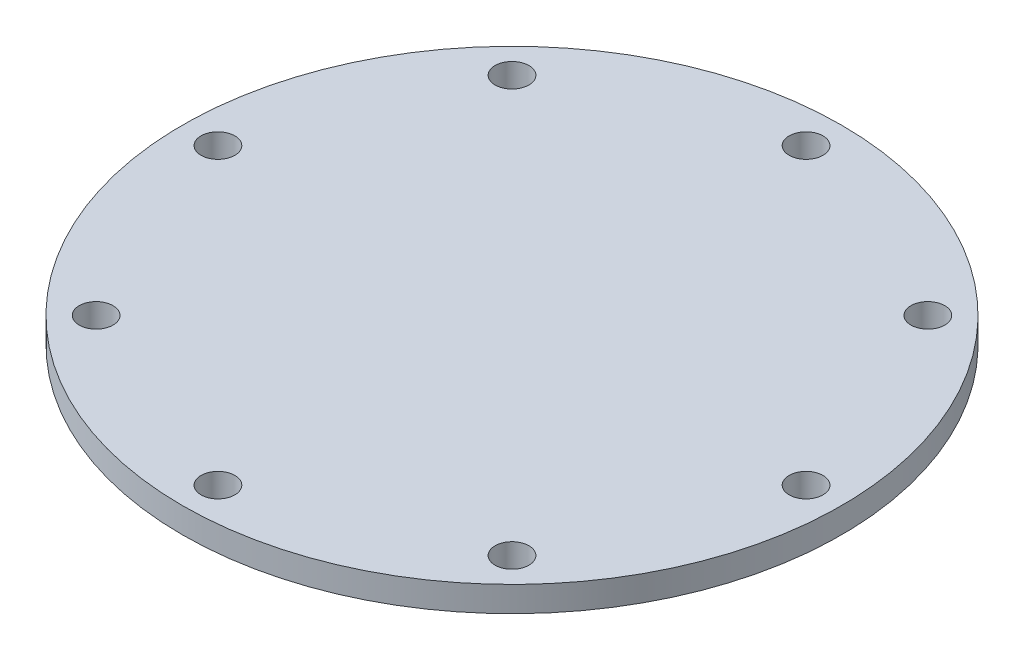
ISO-10303-21;
HEADER;
FILE_DESCRIPTION(('STEP AP214'),'2;1');
FILE_NAME('part.step','',(''),(''),'','','');
FILE_SCHEMA(('AUTOMOTIVE_DESIGN { 1 0 10303 214 1 1 1 1 }'));
ENDSEC;
DATA;
#1=APPLICATION_CONTEXT('core data for automotive mechanical design processes');
#2=APPLICATION_PROTOCOL_DEFINITION('international standard','automotive_design',2000,#1);
#3=PRODUCT_CONTEXT('',#1,'mechanical');
#4=PRODUCT('Part','Part','',(#3));
#5=PRODUCT_RELATED_PRODUCT_CATEGORY('part','',(#4));
#6=PRODUCT_DEFINITION_FORMATION('','',#4);
#7=PRODUCT_DEFINITION_CONTEXT('part definition',#1,'design');
#8=PRODUCT_DEFINITION('design','',#6,#7);
#9=PRODUCT_DEFINITION_SHAPE('','',#8);
#10=(LENGTH_UNIT() NAMED_UNIT(*) SI_UNIT(.MILLI.,.METRE.));
#11=(NAMED_UNIT(*) PLANE_ANGLE_UNIT() SI_UNIT($,.RADIAN.));
#12=(NAMED_UNIT(*) SI_UNIT($,.STERADIAN.) SOLID_ANGLE_UNIT());
#13=UNCERTAINTY_MEASURE_WITH_UNIT(LENGTH_MEASURE(1.E-05),#10,'distance_accuracy_value','');
#14=(GEOMETRIC_REPRESENTATION_CONTEXT(3) GLOBAL_UNCERTAINTY_ASSIGNED_CONTEXT((#13)) GLOBAL_UNIT_ASSIGNED_CONTEXT((#10,
#11,#12)) REPRESENTATION_CONTEXT('',''));
#15=CARTESIAN_POINT('',(0.,0.,0.));
#16=DIRECTION('',(0.,0.,1.));
#17=DIRECTION('',(1.,0.,0.));
#18=AXIS2_PLACEMENT_3D('',#15,#16,#17);
#19=CARTESIAN_POINT('',(0.,15.,0.));
#20=DIRECTION('',(0.,-1.,0.));
#21=DIRECTION('',(0.,0.,-1.));
#22=AXIS2_PLACEMENT_3D('',#19,#20,#21);
#23=CYLINDRICAL_SURFACE('',#22,195.);
#24=CARTESIAN_POINT('',(0.,15.,0.));
#25=DIRECTION('',(0.,1.,0.));
#26=DIRECTION('',(0.,0.,1.));
#27=AXIS2_PLACEMENT_3D('',#24,#25,#26);
#28=CIRCLE('',#27,195.);
#29=CARTESIAN_POINT('',(0.,15.,195.));
#30=VERTEX_POINT('',#29);
#31=EDGE_CURVE('E10',#30,#30,#28,.T.);
#32=ORIENTED_EDGE('',*,*,#31,.F.);
#33=EDGE_LOOP('',(#32));
#34=FACE_BOUND('',#33,.T.);
#35=CARTESIAN_POINT('',(0.,0.,0.));
#36=DIRECTION('',(0.,1.,0.));
#37=DIRECTION('',(0.,0.,1.));
#38=AXIS2_PLACEMENT_3D('',#35,#36,#37);
#39=CIRCLE('',#38,195.);
#40=CARTESIAN_POINT('',(0.,0.,195.));
#41=VERTEX_POINT('',#40);
#42=EDGE_CURVE('E39',#41,#41,#39,.T.);
#43=ORIENTED_EDGE('',*,*,#42,.T.);
#44=EDGE_LOOP('',(#43));
#45=FACE_BOUND('',#44,.T.);
#46=ADVANCED_FACE('F36',(#34,#45),#23,.T.);
#47=CARTESIAN_POINT('',(0.,15.,0.));
#48=DIRECTION('',(0.,1.,0.));
#49=DIRECTION('',(0.,0.,1.));
#50=AXIS2_PLACEMENT_3D('',#47,#48,#49);
#51=PLANE('',#50);
#52=CARTESIAN_POINT('',(-174.,15.,0.));
#53=DIRECTION('',(0.,1.,0.));
#54=DIRECTION('',(0.,0.,1.));
#55=AXIS2_PLACEMENT_3D('',#52,#53,#54);
#56=CIRCLE('',#55,10.);
#57=CARTESIAN_POINT('',(-174.,15.,10.));
#58=VERTEX_POINT('',#57);
#59=EDGE_CURVE('E88',#58,#58,#56,.T.);
#60=ORIENTED_EDGE('',*,*,#59,.F.);
#61=EDGE_LOOP('',(#60));
#62=FACE_BOUND('',#61,.T.);
#63=CARTESIAN_POINT('',(-123.036579926459,15.,-123.036579926459));
#64=DIRECTION('',(0.,1.,0.));
#65=DIRECTION('',(0.,0.,1.));
#66=AXIS2_PLACEMENT_3D('',#63,#64,#65);
#67=CIRCLE('',#66,10.);
#68=CARTESIAN_POINT('',(-123.036579926459,15.,-113.036579926459));
#69=VERTEX_POINT('',#68);
#70=EDGE_CURVE('E82',#69,#69,#67,.T.);
#71=ORIENTED_EDGE('',*,*,#70,.F.);
#72=EDGE_LOOP('',(#71));
#73=FACE_BOUND('',#72,.T.);
#74=CARTESIAN_POINT('',(0.,15.,-174.));
#75=DIRECTION('',(0.,1.,0.));
#76=DIRECTION('',(0.,0.,1.));
#77=AXIS2_PLACEMENT_3D('',#74,#75,#76);
#78=CIRCLE('',#77,10.);
#79=CARTESIAN_POINT('',(0.,15.,-164.));
#80=VERTEX_POINT('',#79);
#81=EDGE_CURVE('E76',#80,#80,#78,.T.);
#82=ORIENTED_EDGE('',*,*,#81,.F.);
#83=EDGE_LOOP('',(#82));
#84=FACE_BOUND('',#83,.T.);
#85=CARTESIAN_POINT('',(123.036579926459,15.,-123.036579926459));
#86=DIRECTION('',(0.,1.,0.));
#87=DIRECTION('',(0.,0.,1.));
#88=AXIS2_PLACEMENT_3D('',#85,#86,#87);
#89=CIRCLE('',#88,10.);
#90=CARTESIAN_POINT('',(123.036579926459,15.,-113.036579926459));
#91=VERTEX_POINT('',#90);
#92=EDGE_CURVE('E70',#91,#91,#89,.T.);
#93=ORIENTED_EDGE('',*,*,#92,.F.);
#94=EDGE_LOOP('',(#93));
#95=FACE_BOUND('',#94,.T.);
#96=CARTESIAN_POINT('',(174.,15.,0.));
#97=DIRECTION('',(0.,1.,0.));
#98=DIRECTION('',(0.,0.,1.));
#99=AXIS2_PLACEMENT_3D('',#96,#97,#98);
#100=CIRCLE('',#99,10.);
#101=CARTESIAN_POINT('',(174.,15.,10.));
#102=VERTEX_POINT('',#101);
#103=EDGE_CURVE('E64',#102,#102,#100,.T.);
#104=ORIENTED_EDGE('',*,*,#103,.F.);
#105=EDGE_LOOP('',(#104));
#106=FACE_BOUND('',#105,.T.);
#107=CARTESIAN_POINT('',(123.036579926459,15.,123.036579926459));
#108=DIRECTION('',(0.,1.,0.));
#109=DIRECTION('',(0.,0.,1.));
#110=AXIS2_PLACEMENT_3D('',#107,#108,#109);
#111=CIRCLE('',#110,10.);
#112=CARTESIAN_POINT('',(123.036579926459,15.,133.036579926459));
#113=VERTEX_POINT('',#112);
#114=EDGE_CURVE('E58',#113,#113,#111,.T.);
#115=ORIENTED_EDGE('',*,*,#114,.F.);
#116=EDGE_LOOP('',(#115));
#117=FACE_BOUND('',#116,.T.);
#118=CARTESIAN_POINT('',(0.,15.,174.));
#119=DIRECTION('',(0.,1.,0.));
#120=DIRECTION('',(0.,0.,1.));
#121=AXIS2_PLACEMENT_3D('',#118,#119,#120);
#122=CIRCLE('',#121,10.);
#123=CARTESIAN_POINT('',(0.,15.,184.));
#124=VERTEX_POINT('',#123);
#125=EDGE_CURVE('E51',#124,#124,#122,.T.);
#126=ORIENTED_EDGE('',*,*,#125,.F.);
#127=EDGE_LOOP('',(#126));
#128=FACE_BOUND('',#127,.T.);
#129=CARTESIAN_POINT('',(-123.036579926459,15.,123.036579926459));
#130=DIRECTION('',(0.,1.,0.));
#131=DIRECTION('',(0.,0.,1.));
#132=AXIS2_PLACEMENT_3D('',#129,#130,#131);
#133=CIRCLE('',#132,10.);
#134=CARTESIAN_POINT('',(-123.036579926459,15.,133.036579926459));
#135=VERTEX_POINT('',#134);
#136=EDGE_CURVE('E52',#135,#135,#133,.T.);
#137=ORIENTED_EDGE('',*,*,#136,.F.);
#138=EDGE_LOOP('',(#137));
#139=FACE_BOUND('',#138,.T.);
#140=ORIENTED_EDGE('',*,*,#31,.T.);
#141=EDGE_LOOP('',(#140));
#142=FACE_BOUND('',#141,.T.);
#143=ADVANCED_FACE('F99',(#62,#73,#84,#95,#106,#117,#128,#139,#142),#51,.T.);
#144=CARTESIAN_POINT('',(0.,0.,0.));
#145=DIRECTION('',(0.,1.,0.));
#146=DIRECTION('',(0.,0.,1.));
#147=AXIS2_PLACEMENT_3D('',#144,#145,#146);
#148=PLANE('',#147);
#149=CARTESIAN_POINT('',(-174.,0.,0.));
#150=DIRECTION('',(0.,1.,0.));
#151=DIRECTION('',(0.,0.,1.));
#152=AXIS2_PLACEMENT_3D('',#149,#150,#151);
#153=CIRCLE('',#152,10.);
#154=CARTESIAN_POINT('',(-174.,0.,10.));
#155=VERTEX_POINT('',#154);
#156=EDGE_CURVE('E46',#155,#155,#153,.F.);
#157=ORIENTED_EDGE('',*,*,#156,.F.);
#158=EDGE_LOOP('',(#157));
#159=FACE_BOUND('',#158,.T.);
#160=CARTESIAN_POINT('',(-123.036579926459,0.,-123.036579926459));
#161=DIRECTION('',(0.,1.,0.));
#162=DIRECTION('',(0.,0.,1.));
#163=AXIS2_PLACEMENT_3D('',#160,#161,#162);
#164=CIRCLE('',#163,10.);
#165=CARTESIAN_POINT('',(-123.036579926459,0.,-113.036579926459));
#166=VERTEX_POINT('',#165);
#167=EDGE_CURVE('E85',#166,#166,#164,.F.);
#168=ORIENTED_EDGE('',*,*,#167,.F.);
#169=EDGE_LOOP('',(#168));
#170=FACE_BOUND('',#169,.T.);
#171=CARTESIAN_POINT('',(0.,0.,-174.));
#172=DIRECTION('',(0.,1.,0.));
#173=DIRECTION('',(0.,0.,1.));
#174=AXIS2_PLACEMENT_3D('',#171,#172,#173);
#175=CIRCLE('',#174,10.);
#176=CARTESIAN_POINT('',(0.,0.,-164.));
#177=VERTEX_POINT('',#176);
#178=EDGE_CURVE('E79',#177,#177,#175,.F.);
#179=ORIENTED_EDGE('',*,*,#178,.F.);
#180=EDGE_LOOP('',(#179));
#181=FACE_BOUND('',#180,.T.);
#182=CARTESIAN_POINT('',(123.036579926459,0.,-123.036579926459));
#183=DIRECTION('',(0.,1.,0.));
#184=DIRECTION('',(0.,0.,1.));
#185=AXIS2_PLACEMENT_3D('',#182,#183,#184);
#186=CIRCLE('',#185,10.);
#187=CARTESIAN_POINT('',(123.036579926459,0.,-113.036579926459));
#188=VERTEX_POINT('',#187);
#189=EDGE_CURVE('E73',#188,#188,#186,.F.);
#190=ORIENTED_EDGE('',*,*,#189,.F.);
#191=EDGE_LOOP('',(#190));
#192=FACE_BOUND('',#191,.T.);
#193=CARTESIAN_POINT('',(174.,0.,0.));
#194=DIRECTION('',(0.,1.,0.));
#195=DIRECTION('',(0.,0.,1.));
#196=AXIS2_PLACEMENT_3D('',#193,#194,#195);
#197=CIRCLE('',#196,10.);
#198=CARTESIAN_POINT('',(174.,0.,10.));
#199=VERTEX_POINT('',#198);
#200=EDGE_CURVE('E67',#199,#199,#197,.F.);
#201=ORIENTED_EDGE('',*,*,#200,.F.);
#202=EDGE_LOOP('',(#201));
#203=FACE_BOUND('',#202,.T.);
#204=CARTESIAN_POINT('',(123.036579926459,0.,123.036579926459));
#205=DIRECTION('',(0.,1.,0.));
#206=DIRECTION('',(0.,0.,1.));
#207=AXIS2_PLACEMENT_3D('',#204,#205,#206);
#208=CIRCLE('',#207,10.);
#209=CARTESIAN_POINT('',(123.036579926459,0.,133.036579926459));
#210=VERTEX_POINT('',#209);
#211=EDGE_CURVE('E61',#210,#210,#208,.F.);
#212=ORIENTED_EDGE('',*,*,#211,.F.);
#213=EDGE_LOOP('',(#212));
#214=FACE_BOUND('',#213,.T.);
#215=CARTESIAN_POINT('',(0.,0.,174.));
#216=DIRECTION('',(0.,1.,0.));
#217=DIRECTION('',(0.,0.,1.));
#218=AXIS2_PLACEMENT_3D('',#215,#216,#217);
#219=CIRCLE('',#218,10.);
#220=CARTESIAN_POINT('',(0.,0.,184.));
#221=VERTEX_POINT('',#220);
#222=EDGE_CURVE('E55',#221,#221,#219,.F.);
#223=ORIENTED_EDGE('',*,*,#222,.F.);
#224=EDGE_LOOP('',(#223));
#225=FACE_BOUND('',#224,.T.);
#226=CARTESIAN_POINT('',(-123.036579926459,0.,123.036579926459));
#227=DIRECTION('',(0.,1.,0.));
#228=DIRECTION('',(0.,0.,1.));
#229=AXIS2_PLACEMENT_3D('',#226,#227,#228);
#230=CIRCLE('',#229,10.);
#231=CARTESIAN_POINT('',(-123.036579926459,0.,133.036579926459));
#232=VERTEX_POINT('',#231);
#233=EDGE_CURVE('E48',#232,#232,#230,.F.);
#234=ORIENTED_EDGE('',*,*,#233,.F.);
#235=EDGE_LOOP('',(#234));
#236=FACE_BOUND('',#235,.T.);
#237=ORIENTED_EDGE('',*,*,#42,.F.);
#238=EDGE_LOOP('',(#237));
#239=FACE_BOUND('',#238,.T.);
#240=ADVANCED_FACE('F102',(#159,#170,#181,#192,#203,#214,#225,#236,#239),#148,.F.);
#241=CARTESIAN_POINT('',(-123.036579926459,-0.000999999999999265,123.036579926459));
#242=DIRECTION('',(0.,1.,0.));
#243=DIRECTION('',(0.,0.,1.));
#244=AXIS2_PLACEMENT_3D('',#241,#242,#243);
#245=CYLINDRICAL_SURFACE('',#244,10.);
#246=CARTESIAN_POINT('',(-123.036579926459,15.,133.036579926459));
#247=CARTESIAN_POINT('',(-123.036579926459,14.84375,133.036579926459));
#248=CARTESIAN_POINT('',(-123.036579926459,14.6875,133.036579926459));
#249=CARTESIAN_POINT('',(-123.036579926459,14.375,133.036579926459));
#250=CARTESIAN_POINT('',(-123.036579926459,14.21875,133.036579926459));
#251=CARTESIAN_POINT('',(-123.036579926459,13.90625,133.036579926459));
#252=CARTESIAN_POINT('',(-123.036579926459,13.75,133.036579926459));
#253=CARTESIAN_POINT('',(-123.036579926459,13.4375,133.036579926459));
#254=CARTESIAN_POINT('',(-123.036579926459,13.28125,133.036579926459));
#255=CARTESIAN_POINT('',(-123.036579926459,12.96875,133.036579926459));
#256=CARTESIAN_POINT('',(-123.036579926459,12.8125,133.036579926459));
#257=CARTESIAN_POINT('',(-123.036579926459,12.5,133.036579926459));
#258=CARTESIAN_POINT('',(-123.036579926459,12.34375,133.036579926459));
#259=CARTESIAN_POINT('',(-123.036579926459,12.03125,133.036579926459));
#260=CARTESIAN_POINT('',(-123.036579926459,11.875,133.036579926459));
#261=CARTESIAN_POINT('',(-123.036579926459,11.5625,133.036579926459));
#262=CARTESIAN_POINT('',(-123.036579926459,11.40625,133.036579926459));
#263=CARTESIAN_POINT('',(-123.036579926459,11.09375,133.036579926459));
#264=CARTESIAN_POINT('',(-123.036579926459,10.9375,133.036579926459));
#265=CARTESIAN_POINT('',(-123.036579926459,10.625,133.036579926459));
#266=CARTESIAN_POINT('',(-123.036579926459,10.46875,133.036579926459));
#267=CARTESIAN_POINT('',(-123.036579926459,10.15625,133.036579926459));
#268=CARTESIAN_POINT('',(-123.036579926459,10.,133.036579926459));
#269=CARTESIAN_POINT('',(-123.036579926459,9.6875,133.036579926459));
#270=CARTESIAN_POINT('',(-123.036579926459,9.53125,133.036579926459));
#271=CARTESIAN_POINT('',(-123.036579926459,9.21875,133.036579926459));
#272=CARTESIAN_POINT('',(-123.036579926459,9.0625,133.036579926459));
#273=CARTESIAN_POINT('',(-123.036579926459,8.75,133.036579926459));
#274=CARTESIAN_POINT('',(-123.036579926459,8.59375,133.036579926459));
#275=CARTESIAN_POINT('',(-123.036579926459,8.28125,133.036579926459));
#276=CARTESIAN_POINT('',(-123.036579926459,8.125,133.036579926459));
#277=CARTESIAN_POINT('',(-123.036579926459,7.8125,133.036579926459));
#278=CARTESIAN_POINT('',(-123.036579926459,7.65625,133.036579926459));
#279=CARTESIAN_POINT('',(-123.036579926459,7.34375,133.036579926459));
#280=CARTESIAN_POINT('',(-123.036579926459,7.1875,133.036579926459));
#281=CARTESIAN_POINT('',(-123.036579926459,6.875,133.036579926459));
#282=CARTESIAN_POINT('',(-123.036579926459,6.71875,133.036579926459));
#283=CARTESIAN_POINT('',(-123.036579926459,6.40625,133.036579926459));
#284=CARTESIAN_POINT('',(-123.036579926459,6.25,133.036579926459));
#285=CARTESIAN_POINT('',(-123.036579926459,5.9375,133.036579926459));
#286=CARTESIAN_POINT('',(-123.036579926459,5.78125,133.036579926459));
#287=CARTESIAN_POINT('',(-123.036579926459,5.46875,133.036579926459));
#288=CARTESIAN_POINT('',(-123.036579926459,5.3125,133.036579926459));
#289=CARTESIAN_POINT('',(-123.036579926459,5.,133.036579926459));
#290=CARTESIAN_POINT('',(-123.036579926459,4.84375,133.036579926459));
#291=CARTESIAN_POINT('',(-123.036579926459,4.53125,133.036579926459));
#292=CARTESIAN_POINT('',(-123.036579926459,4.375,133.036579926459));
#293=CARTESIAN_POINT('',(-123.036579926459,4.0625,133.036579926459));
#294=CARTESIAN_POINT('',(-123.036579926459,3.90625,133.036579926459));
#295=CARTESIAN_POINT('',(-123.036579926459,3.59375,133.036579926459));
#296=CARTESIAN_POINT('',(-123.036579926459,3.4375,133.036579926459));
#297=CARTESIAN_POINT('',(-123.036579926459,3.125,133.036579926459));
#298=CARTESIAN_POINT('',(-123.036579926459,2.96875,133.036579926459));
#299=CARTESIAN_POINT('',(-123.036579926459,2.65625,133.036579926459));
#300=CARTESIAN_POINT('',(-123.036579926459,2.5,133.036579926459));
#301=CARTESIAN_POINT('',(-123.036579926459,2.1875,133.036579926459));
#302=CARTESIAN_POINT('',(-123.036579926459,2.03125,133.036579926459));
#303=CARTESIAN_POINT('',(-123.036579926459,1.71875,133.036579926459));
#304=CARTESIAN_POINT('',(-123.036579926459,1.5625,133.036579926459));
#305=CARTESIAN_POINT('',(-123.036579926459,1.25,133.036579926459));
#306=CARTESIAN_POINT('',(-123.036579926459,1.09375,133.036579926459));
#307=CARTESIAN_POINT('',(-123.036579926459,0.781250000000001,133.036579926459));
#308=CARTESIAN_POINT('',(-123.036579926459,0.625,133.036579926459));
#309=CARTESIAN_POINT('',(-123.036579926459,0.3125,133.036579926459));
#310=CARTESIAN_POINT('',(-123.036579926459,0.15625,133.036579926459));
#311=CARTESIAN_POINT('',(-123.036579926459,0.,133.036579926459));
#312=B_SPLINE_CURVE_WITH_KNOTS('',3,(#246,#247,#248,#249,#250,#251,#252,#253,#254,#255,#256,
#257,#258,#259,#260,#261,#262,#263,#264,#265,#266,#267,#268,#269,#270,#271,#272,#273,#274,#275,
#276,#277,#278,#279,#280,#281,#282,#283,#284,#285,#286,#287,#288,#289,#290,#291,#292,#293,#294,
#295,#296,#297,#298,#299,#300,#301,#302,#303,#304,#305,#306,#307,#308,#309,#310,#311),
.UNSPECIFIED.,.F.,.F.,(4,2,2,2,2,2,2,2,2,2,2,2,2,2,2,2,2,2,2,2,2,2,2,2,2,2,2,2,2,2,2,2,4),(0.,
0.46875,0.937500000000001,1.40625,1.875,2.34375,2.8125,3.28125,3.75,4.21875,4.6875,5.15625,
5.625,6.09375,6.5625,7.03125,7.5,7.96875,8.4375,8.90625,9.375,9.84375,10.3125,10.78125,11.25,
11.71875,12.1875,12.65625,13.125,13.59375,14.0625,14.53125,15.),.UNSPECIFIED.);
#313=EDGE_CURVE('BSEAM118',#135,#232,#312,.T.);
#314=ORIENTED_EDGE('',*,*,#136,.T.);
#315=ORIENTED_EDGE('',*,*,#233,.T.);
#316=ORIENTED_EDGE('',*,*,#313,.T.);
#317=ORIENTED_EDGE('',*,*,#313,.F.);
#318=EDGE_LOOP('',(#314,#316,#315,#317));
#319=FACE_BOUND('',#318,.T.);
#320=ADVANCED_FACE('F118',(#319),#245,.F.);
#321=CARTESIAN_POINT('',(0.,-0.000999999999999265,174.));
#322=DIRECTION('',(0.,1.,0.));
#323=DIRECTION('',(0.,0.,1.));
#324=AXIS2_PLACEMENT_3D('',#321,#322,#323);
#325=CYLINDRICAL_SURFACE('',#324,10.);
#326=CARTESIAN_POINT('',(0.,15.,184.));
#327=CARTESIAN_POINT('',(0.,14.84375,184.));
#328=CARTESIAN_POINT('',(0.,14.6875,184.));
#329=CARTESIAN_POINT('',(0.,14.375,184.));
#330=CARTESIAN_POINT('',(0.,14.21875,184.));
#331=CARTESIAN_POINT('',(0.,13.90625,184.));
#332=CARTESIAN_POINT('',(0.,13.75,184.));
#333=CARTESIAN_POINT('',(0.,13.4375,184.));
#334=CARTESIAN_POINT('',(0.,13.28125,184.));
#335=CARTESIAN_POINT('',(0.,12.96875,184.));
#336=CARTESIAN_POINT('',(0.,12.8125,184.));
#337=CARTESIAN_POINT('',(0.,12.5,184.));
#338=CARTESIAN_POINT('',(0.,12.34375,184.));
#339=CARTESIAN_POINT('',(0.,12.03125,184.));
#340=CARTESIAN_POINT('',(0.,11.875,184.));
#341=CARTESIAN_POINT('',(0.,11.5625,184.));
#342=CARTESIAN_POINT('',(0.,11.40625,184.));
#343=CARTESIAN_POINT('',(0.,11.09375,184.));
#344=CARTESIAN_POINT('',(0.,10.9375,184.));
#345=CARTESIAN_POINT('',(0.,10.625,184.));
#346=CARTESIAN_POINT('',(0.,10.46875,184.));
#347=CARTESIAN_POINT('',(0.,10.15625,184.));
#348=CARTESIAN_POINT('',(0.,10.,184.));
#349=CARTESIAN_POINT('',(0.,9.6875,184.));
#350=CARTESIAN_POINT('',(0.,9.53125,184.));
#351=CARTESIAN_POINT('',(0.,9.21875,184.));
#352=CARTESIAN_POINT('',(0.,9.0625,184.));
#353=CARTESIAN_POINT('',(0.,8.75,184.));
#354=CARTESIAN_POINT('',(0.,8.59375,184.));
#355=CARTESIAN_POINT('',(0.,8.28125,184.));
#356=CARTESIAN_POINT('',(0.,8.125,184.));
#357=CARTESIAN_POINT('',(0.,7.8125,184.));
#358=CARTESIAN_POINT('',(0.,7.65625,184.));
#359=CARTESIAN_POINT('',(0.,7.34375,184.));
#360=CARTESIAN_POINT('',(0.,7.1875,184.));
#361=CARTESIAN_POINT('',(0.,6.875,184.));
#362=CARTESIAN_POINT('',(0.,6.71875,184.));
#363=CARTESIAN_POINT('',(0.,6.40625,184.));
#364=CARTESIAN_POINT('',(0.,6.25,184.));
#365=CARTESIAN_POINT('',(0.,5.9375,184.));
#366=CARTESIAN_POINT('',(0.,5.78125,184.));
#367=CARTESIAN_POINT('',(0.,5.46875,184.));
#368=CARTESIAN_POINT('',(0.,5.3125,184.));
#369=CARTESIAN_POINT('',(0.,5.,184.));
#370=CARTESIAN_POINT('',(0.,4.84375,184.));
#371=CARTESIAN_POINT('',(0.,4.53125,184.));
#372=CARTESIAN_POINT('',(0.,4.375,184.));
#373=CARTESIAN_POINT('',(0.,4.0625,184.));
#374=CARTESIAN_POINT('',(0.,3.90625,184.));
#375=CARTESIAN_POINT('',(0.,3.59375,184.));
#376=CARTESIAN_POINT('',(0.,3.4375,184.));
#377=CARTESIAN_POINT('',(0.,3.125,184.));
#378=CARTESIAN_POINT('',(0.,2.96875,184.));
#379=CARTESIAN_POINT('',(0.,2.65625,184.));
#380=CARTESIAN_POINT('',(0.,2.5,184.));
#381=CARTESIAN_POINT('',(0.,2.1875,184.));
#382=CARTESIAN_POINT('',(0.,2.03125,184.));
#383=CARTESIAN_POINT('',(0.,1.71875,184.));
#384=CARTESIAN_POINT('',(0.,1.5625,184.));
#385=CARTESIAN_POINT('',(0.,1.25,184.));
#386=CARTESIAN_POINT('',(0.,1.09375,184.));
#387=CARTESIAN_POINT('',(0.,0.781250000000001,184.));
#388=CARTESIAN_POINT('',(0.,0.625,184.));
#389=CARTESIAN_POINT('',(0.,0.3125,184.));
#390=CARTESIAN_POINT('',(0.,0.15625,184.));
#391=CARTESIAN_POINT('',(0.,0.,184.));
#392=B_SPLINE_CURVE_WITH_KNOTS('',3,(#326,#327,#328,#329,#330,#331,#332,#333,#334,#335,#336,
#337,#338,#339,#340,#341,#342,#343,#344,#345,#346,#347,#348,#349,#350,#351,#352,#353,#354,#355,
#356,#357,#358,#359,#360,#361,#362,#363,#364,#365,#366,#367,#368,#369,#370,#371,#372,#373,#374,
#375,#376,#377,#378,#379,#380,#381,#382,#383,#384,#385,#386,#387,#388,#389,#390,#391),
.UNSPECIFIED.,.F.,.F.,(4,2,2,2,2,2,2,2,2,2,2,2,2,2,2,2,2,2,2,2,2,2,2,2,2,2,2,2,2,2,2,2,4),(0.,
0.46875,0.937500000000001,1.40625,1.875,2.34375,2.8125,3.28125,3.75,4.21875,4.6875,5.15625,
5.625,6.09375,6.5625,7.03125,7.5,7.96875,8.4375,8.90625,9.375,9.84375,10.3125,10.78125,11.25,
11.71875,12.1875,12.65625,13.125,13.59375,14.0625,14.53125,15.),.UNSPECIFIED.);
#393=EDGE_CURVE('BSEAM121',#124,#221,#392,.T.);
#394=ORIENTED_EDGE('',*,*,#125,.T.);
#395=ORIENTED_EDGE('',*,*,#222,.T.);
#396=ORIENTED_EDGE('',*,*,#393,.T.);
#397=ORIENTED_EDGE('',*,*,#393,.F.);
#398=EDGE_LOOP('',(#394,#396,#395,#397));
#399=FACE_BOUND('',#398,.T.);
#400=ADVANCED_FACE('F121',(#399),#325,.F.);
#401=CARTESIAN_POINT('',(123.036579926459,-0.000999999999999265,123.036579926459));
#402=DIRECTION('',(0.,1.,0.));
#403=DIRECTION('',(0.,0.,1.));
#404=AXIS2_PLACEMENT_3D('',#401,#402,#403);
#405=CYLINDRICAL_SURFACE('',#404,10.);
#406=CARTESIAN_POINT('',(123.036579926459,15.,133.036579926459));
#407=CARTESIAN_POINT('',(123.036579926459,14.84375,133.036579926459));
#408=CARTESIAN_POINT('',(123.036579926459,14.6875,133.036579926459));
#409=CARTESIAN_POINT('',(123.036579926459,14.375,133.036579926459));
#410=CARTESIAN_POINT('',(123.036579926459,14.21875,133.036579926459));
#411=CARTESIAN_POINT('',(123.036579926459,13.90625,133.036579926459));
#412=CARTESIAN_POINT('',(123.036579926459,13.75,133.036579926459));
#413=CARTESIAN_POINT('',(123.036579926459,13.4375,133.036579926459));
#414=CARTESIAN_POINT('',(123.036579926459,13.28125,133.036579926459));
#415=CARTESIAN_POINT('',(123.036579926459,12.96875,133.036579926459));
#416=CARTESIAN_POINT('',(123.036579926459,12.8125,133.036579926459));
#417=CARTESIAN_POINT('',(123.036579926459,12.5,133.036579926459));
#418=CARTESIAN_POINT('',(123.036579926459,12.34375,133.036579926459));
#419=CARTESIAN_POINT('',(123.036579926459,12.03125,133.036579926459));
#420=CARTESIAN_POINT('',(123.036579926459,11.875,133.036579926459));
#421=CARTESIAN_POINT('',(123.036579926459,11.5625,133.036579926459));
#422=CARTESIAN_POINT('',(123.036579926459,11.40625,133.036579926459));
#423=CARTESIAN_POINT('',(123.036579926459,11.09375,133.036579926459));
#424=CARTESIAN_POINT('',(123.036579926459,10.9375,133.036579926459));
#425=CARTESIAN_POINT('',(123.036579926459,10.625,133.036579926459));
#426=CARTESIAN_POINT('',(123.036579926459,10.46875,133.036579926459));
#427=CARTESIAN_POINT('',(123.036579926459,10.15625,133.036579926459));
#428=CARTESIAN_POINT('',(123.036579926459,10.,133.036579926459));
#429=CARTESIAN_POINT('',(123.036579926459,9.6875,133.036579926459));
#430=CARTESIAN_POINT('',(123.036579926459,9.53125,133.036579926459));
#431=CARTESIAN_POINT('',(123.036579926459,9.21875,133.036579926459));
#432=CARTESIAN_POINT('',(123.036579926459,9.0625,133.036579926459));
#433=CARTESIAN_POINT('',(123.036579926459,8.75,133.036579926459));
#434=CARTESIAN_POINT('',(123.036579926459,8.59375,133.036579926459));
#435=CARTESIAN_POINT('',(123.036579926459,8.28125,133.036579926459));
#436=CARTESIAN_POINT('',(123.036579926459,8.125,133.036579926459));
#437=CARTESIAN_POINT('',(123.036579926459,7.8125,133.036579926459));
#438=CARTESIAN_POINT('',(123.036579926459,7.65625,133.036579926459));
#439=CARTESIAN_POINT('',(123.036579926459,7.34375,133.036579926459));
#440=CARTESIAN_POINT('',(123.036579926459,7.1875,133.036579926459));
#441=CARTESIAN_POINT('',(123.036579926459,6.875,133.036579926459));
#442=CARTESIAN_POINT('',(123.036579926459,6.71875,133.036579926459));
#443=CARTESIAN_POINT('',(123.036579926459,6.40625,133.036579926459));
#444=CARTESIAN_POINT('',(123.036579926459,6.25,133.036579926459));
#445=CARTESIAN_POINT('',(123.036579926459,5.9375,133.036579926459));
#446=CARTESIAN_POINT('',(123.036579926459,5.78125,133.036579926459));
#447=CARTESIAN_POINT('',(123.036579926459,5.46875,133.036579926459));
#448=CARTESIAN_POINT('',(123.036579926459,5.3125,133.036579926459));
#449=CARTESIAN_POINT('',(123.036579926459,5.,133.036579926459));
#450=CARTESIAN_POINT('',(123.036579926459,4.84375,133.036579926459));
#451=CARTESIAN_POINT('',(123.036579926459,4.53125,133.036579926459));
#452=CARTESIAN_POINT('',(123.036579926459,4.375,133.036579926459));
#453=CARTESIAN_POINT('',(123.036579926459,4.0625,133.036579926459));
#454=CARTESIAN_POINT('',(123.036579926459,3.90625,133.036579926459));
#455=CARTESIAN_POINT('',(123.036579926459,3.59375,133.036579926459));
#456=CARTESIAN_POINT('',(123.036579926459,3.4375,133.036579926459));
#457=CARTESIAN_POINT('',(123.036579926459,3.125,133.036579926459));
#458=CARTESIAN_POINT('',(123.036579926459,2.96875,133.036579926459));
#459=CARTESIAN_POINT('',(123.036579926459,2.65625,133.036579926459));
#460=CARTESIAN_POINT('',(123.036579926459,2.5,133.036579926459));
#461=CARTESIAN_POINT('',(123.036579926459,2.1875,133.036579926459));
#462=CARTESIAN_POINT('',(123.036579926459,2.03125,133.036579926459));
#463=CARTESIAN_POINT('',(123.036579926459,1.71875,133.036579926459));
#464=CARTESIAN_POINT('',(123.036579926459,1.5625,133.036579926459));
#465=CARTESIAN_POINT('',(123.036579926459,1.25,133.036579926459));
#466=CARTESIAN_POINT('',(123.036579926459,1.09375,133.036579926459));
#467=CARTESIAN_POINT('',(123.036579926459,0.781250000000001,133.036579926459));
#468=CARTESIAN_POINT('',(123.036579926459,0.625,133.036579926459));
#469=CARTESIAN_POINT('',(123.036579926459,0.3125,133.036579926459));
#470=CARTESIAN_POINT('',(123.036579926459,0.15625,133.036579926459));
#471=CARTESIAN_POINT('',(123.036579926459,0.,133.036579926459));
#472=B_SPLINE_CURVE_WITH_KNOTS('',3,(#406,#407,#408,#409,#410,#411,#412,#413,#414,#415,#416,
#417,#418,#419,#420,#421,#422,#423,#424,#425,#426,#427,#428,#429,#430,#431,#432,#433,#434,#435,
#436,#437,#438,#439,#440,#441,#442,#443,#444,#445,#446,#447,#448,#449,#450,#451,#452,#453,#454,
#455,#456,#457,#458,#459,#460,#461,#462,#463,#464,#465,#466,#467,#468,#469,#470,#471),
.UNSPECIFIED.,.F.,.F.,(4,2,2,2,2,2,2,2,2,2,2,2,2,2,2,2,2,2,2,2,2,2,2,2,2,2,2,2,2,2,2,2,4),(0.,
0.46875,0.937500000000001,1.40625,1.875,2.34375,2.8125,3.28125,3.75,4.21875,4.6875,5.15625,
5.625,6.09375,6.5625,7.03125,7.5,7.96875,8.4375,8.90625,9.375,9.84375,10.3125,10.78125,11.25,
11.71875,12.1875,12.65625,13.125,13.59375,14.0625,14.53125,15.),.UNSPECIFIED.);
#473=EDGE_CURVE('BSEAM152',#113,#210,#472,.T.);
#474=ORIENTED_EDGE('',*,*,#114,.T.);
#475=ORIENTED_EDGE('',*,*,#211,.T.);
#476=ORIENTED_EDGE('',*,*,#473,.T.);
#477=ORIENTED_EDGE('',*,*,#473,.F.);
#478=EDGE_LOOP('',(#474,#476,#475,#477));
#479=FACE_BOUND('',#478,.T.);
#480=ADVANCED_FACE('F152',(#479),#405,.F.);
#481=CARTESIAN_POINT('',(174.,-0.000999999999999265,0.));
#482=DIRECTION('',(0.,1.,0.));
#483=DIRECTION('',(0.,0.,1.));
#484=AXIS2_PLACEMENT_3D('',#481,#482,#483);
#485=CYLINDRICAL_SURFACE('',#484,10.);
#486=CARTESIAN_POINT('',(174.,15.,10.));
#487=CARTESIAN_POINT('',(174.,14.84375,10.));
#488=CARTESIAN_POINT('',(174.,14.6875,10.));
#489=CARTESIAN_POINT('',(174.,14.375,10.));
#490=CARTESIAN_POINT('',(174.,14.21875,10.));
#491=CARTESIAN_POINT('',(174.,13.90625,10.));
#492=CARTESIAN_POINT('',(174.,13.75,10.));
#493=CARTESIAN_POINT('',(174.,13.4375,10.));
#494=CARTESIAN_POINT('',(174.,13.28125,10.));
#495=CARTESIAN_POINT('',(174.,12.96875,10.));
#496=CARTESIAN_POINT('',(174.,12.8125,10.));
#497=CARTESIAN_POINT('',(174.,12.5,10.));
#498=CARTESIAN_POINT('',(174.,12.34375,10.));
#499=CARTESIAN_POINT('',(174.,12.03125,10.));
#500=CARTESIAN_POINT('',(174.,11.875,10.));
#501=CARTESIAN_POINT('',(174.,11.5625,10.));
#502=CARTESIAN_POINT('',(174.,11.40625,10.));
#503=CARTESIAN_POINT('',(174.,11.09375,10.));
#504=CARTESIAN_POINT('',(174.,10.9375,10.));
#505=CARTESIAN_POINT('',(174.,10.625,10.));
#506=CARTESIAN_POINT('',(174.,10.46875,10.));
#507=CARTESIAN_POINT('',(174.,10.15625,10.));
#508=CARTESIAN_POINT('',(174.,10.,10.));
#509=CARTESIAN_POINT('',(174.,9.6875,10.));
#510=CARTESIAN_POINT('',(174.,9.53125,10.));
#511=CARTESIAN_POINT('',(174.,9.21875,10.));
#512=CARTESIAN_POINT('',(174.,9.0625,10.));
#513=CARTESIAN_POINT('',(174.,8.75,10.));
#514=CARTESIAN_POINT('',(174.,8.59375,10.));
#515=CARTESIAN_POINT('',(174.,8.28125,10.));
#516=CARTESIAN_POINT('',(174.,8.125,10.));
#517=CARTESIAN_POINT('',(174.,7.8125,10.));
#518=CARTESIAN_POINT('',(174.,7.65625,10.));
#519=CARTESIAN_POINT('',(174.,7.34375,10.));
#520=CARTESIAN_POINT('',(174.,7.1875,10.));
#521=CARTESIAN_POINT('',(174.,6.875,10.));
#522=CARTESIAN_POINT('',(174.,6.71875,10.));
#523=CARTESIAN_POINT('',(174.,6.40625,10.));
#524=CARTESIAN_POINT('',(174.,6.25,10.));
#525=CARTESIAN_POINT('',(174.,5.9375,10.));
#526=CARTESIAN_POINT('',(174.,5.78125,10.));
#527=CARTESIAN_POINT('',(174.,5.46875,10.));
#528=CARTESIAN_POINT('',(174.,5.3125,10.));
#529=CARTESIAN_POINT('',(174.,5.,10.));
#530=CARTESIAN_POINT('',(174.,4.84375,10.));
#531=CARTESIAN_POINT('',(174.,4.53125,10.));
#532=CARTESIAN_POINT('',(174.,4.375,10.));
#533=CARTESIAN_POINT('',(174.,4.0625,10.));
#534=CARTESIAN_POINT('',(174.,3.90625,10.));
#535=CARTESIAN_POINT('',(174.,3.59375,10.));
#536=CARTESIAN_POINT('',(174.,3.4375,10.));
#537=CARTESIAN_POINT('',(174.,3.125,10.));
#538=CARTESIAN_POINT('',(174.,2.96875,10.));
#539=CARTESIAN_POINT('',(174.,2.65625,10.));
#540=CARTESIAN_POINT('',(174.,2.5,10.));
#541=CARTESIAN_POINT('',(174.,2.1875,10.));
#542=CARTESIAN_POINT('',(174.,2.03125,10.));
#543=CARTESIAN_POINT('',(174.,1.71875,10.));
#544=CARTESIAN_POINT('',(174.,1.5625,10.));
#545=CARTESIAN_POINT('',(174.,1.25,10.));
#546=CARTESIAN_POINT('',(174.,1.09375,10.));
#547=CARTESIAN_POINT('',(174.,0.781250000000001,10.));
#548=CARTESIAN_POINT('',(174.,0.625,10.));
#549=CARTESIAN_POINT('',(174.,0.3125,10.));
#550=CARTESIAN_POINT('',(174.,0.15625,10.));
#551=CARTESIAN_POINT('',(174.,0.,10.));
#552=B_SPLINE_CURVE_WITH_KNOTS('',3,(#486,#487,#488,#489,#490,#491,#492,#493,#494,#495,#496,
#497,#498,#499,#500,#501,#502,#503,#504,#505,#506,#507,#508,#509,#510,#511,#512,#513,#514,#515,
#516,#517,#518,#519,#520,#521,#522,#523,#524,#525,#526,#527,#528,#529,#530,#531,#532,#533,#534,
#535,#536,#537,#538,#539,#540,#541,#542,#543,#544,#545,#546,#547,#548,#549,#550,#551),
.UNSPECIFIED.,.F.,.F.,(4,2,2,2,2,2,2,2,2,2,2,2,2,2,2,2,2,2,2,2,2,2,2,2,2,2,2,2,2,2,2,2,4),(0.,
0.46875,0.937500000000001,1.40625,1.875,2.34375,2.8125,3.28125,3.75,4.21875,4.6875,5.15625,
5.625,6.09375,6.5625,7.03125,7.5,7.96875,8.4375,8.90625,9.375,9.84375,10.3125,10.78125,11.25,
11.71875,12.1875,12.65625,13.125,13.59375,14.0625,14.53125,15.),.UNSPECIFIED.);
#553=EDGE_CURVE('BSEAM160',#102,#199,#552,.T.);
#554=ORIENTED_EDGE('',*,*,#103,.T.);
#555=ORIENTED_EDGE('',*,*,#200,.T.);
#556=ORIENTED_EDGE('',*,*,#553,.T.);
#557=ORIENTED_EDGE('',*,*,#553,.F.);
#558=EDGE_LOOP('',(#554,#556,#555,#557));
#559=FACE_BOUND('',#558,.T.);
#560=ADVANCED_FACE('F160',(#559),#485,.F.);
#561=CARTESIAN_POINT('',(123.036579926459,-0.000999999999999265,-123.036579926459));
#562=DIRECTION('',(0.,1.,0.));
#563=DIRECTION('',(0.,0.,1.));
#564=AXIS2_PLACEMENT_3D('',#561,#562,#563);
#565=CYLINDRICAL_SURFACE('',#564,10.);
#566=CARTESIAN_POINT('',(123.036579926459,15.,-113.036579926459));
#567=CARTESIAN_POINT('',(123.036579926459,14.84375,-113.036579926459));
#568=CARTESIAN_POINT('',(123.036579926459,14.6875,-113.036579926459));
#569=CARTESIAN_POINT('',(123.036579926459,14.375,-113.036579926459));
#570=CARTESIAN_POINT('',(123.036579926459,14.21875,-113.036579926459));
#571=CARTESIAN_POINT('',(123.036579926459,13.90625,-113.036579926459));
#572=CARTESIAN_POINT('',(123.036579926459,13.75,-113.036579926459));
#573=CARTESIAN_POINT('',(123.036579926459,13.4375,-113.036579926459));
#574=CARTESIAN_POINT('',(123.036579926459,13.28125,-113.036579926459));
#575=CARTESIAN_POINT('',(123.036579926459,12.96875,-113.036579926459));
#576=CARTESIAN_POINT('',(123.036579926459,12.8125,-113.036579926459));
#577=CARTESIAN_POINT('',(123.036579926459,12.5,-113.036579926459));
#578=CARTESIAN_POINT('',(123.036579926459,12.34375,-113.036579926459));
#579=CARTESIAN_POINT('',(123.036579926459,12.03125,-113.036579926459));
#580=CARTESIAN_POINT('',(123.036579926459,11.875,-113.036579926459));
#581=CARTESIAN_POINT('',(123.036579926459,11.5625,-113.036579926459));
#582=CARTESIAN_POINT('',(123.036579926459,11.40625,-113.036579926459));
#583=CARTESIAN_POINT('',(123.036579926459,11.09375,-113.036579926459));
#584=CARTESIAN_POINT('',(123.036579926459,10.9375,-113.036579926459));
#585=CARTESIAN_POINT('',(123.036579926459,10.625,-113.036579926459));
#586=CARTESIAN_POINT('',(123.036579926459,10.46875,-113.036579926459));
#587=CARTESIAN_POINT('',(123.036579926459,10.15625,-113.036579926459));
#588=CARTESIAN_POINT('',(123.036579926459,10.,-113.036579926459));
#589=CARTESIAN_POINT('',(123.036579926459,9.6875,-113.036579926459));
#590=CARTESIAN_POINT('',(123.036579926459,9.53125,-113.036579926459));
#591=CARTESIAN_POINT('',(123.036579926459,9.21875,-113.036579926459));
#592=CARTESIAN_POINT('',(123.036579926459,9.0625,-113.036579926459));
#593=CARTESIAN_POINT('',(123.036579926459,8.75,-113.036579926459));
#594=CARTESIAN_POINT('',(123.036579926459,8.59375,-113.036579926459));
#595=CARTESIAN_POINT('',(123.036579926459,8.28125,-113.036579926459));
#596=CARTESIAN_POINT('',(123.036579926459,8.125,-113.036579926459));
#597=CARTESIAN_POINT('',(123.036579926459,7.8125,-113.036579926459));
#598=CARTESIAN_POINT('',(123.036579926459,7.65625,-113.036579926459));
#599=CARTESIAN_POINT('',(123.036579926459,7.34375,-113.036579926459));
#600=CARTESIAN_POINT('',(123.036579926459,7.1875,-113.036579926459));
#601=CARTESIAN_POINT('',(123.036579926459,6.875,-113.036579926459));
#602=CARTESIAN_POINT('',(123.036579926459,6.71875,-113.036579926459));
#603=CARTESIAN_POINT('',(123.036579926459,6.40625,-113.036579926459));
#604=CARTESIAN_POINT('',(123.036579926459,6.25,-113.036579926459));
#605=CARTESIAN_POINT('',(123.036579926459,5.9375,-113.036579926459));
#606=CARTESIAN_POINT('',(123.036579926459,5.78125,-113.036579926459));
#607=CARTESIAN_POINT('',(123.036579926459,5.46875,-113.036579926459));
#608=CARTESIAN_POINT('',(123.036579926459,5.3125,-113.036579926459));
#609=CARTESIAN_POINT('',(123.036579926459,5.,-113.036579926459));
#610=CARTESIAN_POINT('',(123.036579926459,4.84375,-113.036579926459));
#611=CARTESIAN_POINT('',(123.036579926459,4.53125,-113.036579926459));
#612=CARTESIAN_POINT('',(123.036579926459,4.375,-113.036579926459));
#613=CARTESIAN_POINT('',(123.036579926459,4.0625,-113.036579926459));
#614=CARTESIAN_POINT('',(123.036579926459,3.90625,-113.036579926459));
#615=CARTESIAN_POINT('',(123.036579926459,3.59375,-113.036579926459));
#616=CARTESIAN_POINT('',(123.036579926459,3.4375,-113.036579926459));
#617=CARTESIAN_POINT('',(123.036579926459,3.125,-113.036579926459));
#618=CARTESIAN_POINT('',(123.036579926459,2.96875,-113.036579926459));
#619=CARTESIAN_POINT('',(123.036579926459,2.65625,-113.036579926459));
#620=CARTESIAN_POINT('',(123.036579926459,2.5,-113.036579926459));
#621=CARTESIAN_POINT('',(123.036579926459,2.1875,-113.036579926459));
#622=CARTESIAN_POINT('',(123.036579926459,2.03125,-113.036579926459));
#623=CARTESIAN_POINT('',(123.036579926459,1.71875,-113.036579926459));
#624=CARTESIAN_POINT('',(123.036579926459,1.5625,-113.036579926459));
#625=CARTESIAN_POINT('',(123.036579926459,1.25,-113.036579926459));
#626=CARTESIAN_POINT('',(123.036579926459,1.09375,-113.036579926459));
#627=CARTESIAN_POINT('',(123.036579926459,0.781250000000001,-113.036579926459));
#628=CARTESIAN_POINT('',(123.036579926459,0.625,-113.036579926459));
#629=CARTESIAN_POINT('',(123.036579926459,0.3125,-113.036579926459));
#630=CARTESIAN_POINT('',(123.036579926459,0.15625,-113.036579926459));
#631=CARTESIAN_POINT('',(123.036579926459,0.,-113.036579926459));
#632=B_SPLINE_CURVE_WITH_KNOTS('',3,(#566,#567,#568,#569,#570,#571,#572,#573,#574,#575,#576,
#577,#578,#579,#580,#581,#582,#583,#584,#585,#586,#587,#588,#589,#590,#591,#592,#593,#594,#595,
#596,#597,#598,#599,#600,#601,#602,#603,#604,#605,#606,#607,#608,#609,#610,#611,#612,#613,#614,
#615,#616,#617,#618,#619,#620,#621,#622,#623,#624,#625,#626,#627,#628,#629,#630,#631),
.UNSPECIFIED.,.F.,.F.,(4,2,2,2,2,2,2,2,2,2,2,2,2,2,2,2,2,2,2,2,2,2,2,2,2,2,2,2,2,2,2,2,4),(0.,
0.46875,0.937500000000001,1.40625,1.875,2.34375,2.8125,3.28125,3.75,4.21875,4.6875,5.15625,
5.625,6.09375,6.5625,7.03125,7.5,7.96875,8.4375,8.90625,9.375,9.84375,10.3125,10.78125,11.25,
11.71875,12.1875,12.65625,13.125,13.59375,14.0625,14.53125,15.),.UNSPECIFIED.);
#633=EDGE_CURVE('BSEAM168',#91,#188,#632,.T.);
#634=ORIENTED_EDGE('',*,*,#92,.T.);
#635=ORIENTED_EDGE('',*,*,#189,.T.);
#636=ORIENTED_EDGE('',*,*,#633,.T.);
#637=ORIENTED_EDGE('',*,*,#633,.F.);
#638=EDGE_LOOP('',(#634,#636,#635,#637));
#639=FACE_BOUND('',#638,.T.);
#640=ADVANCED_FACE('F168',(#639),#565,.F.);
#641=CARTESIAN_POINT('',(0.,-0.000999999999999265,-174.));
#642=DIRECTION('',(0.,1.,0.));
#643=DIRECTION('',(0.,0.,1.));
#644=AXIS2_PLACEMENT_3D('',#641,#642,#643);
#645=CYLINDRICAL_SURFACE('',#644,10.);
#646=CARTESIAN_POINT('',(0.,15.,-164.));
#647=CARTESIAN_POINT('',(0.,14.84375,-164.));
#648=CARTESIAN_POINT('',(0.,14.6875,-164.));
#649=CARTESIAN_POINT('',(0.,14.375,-164.));
#650=CARTESIAN_POINT('',(0.,14.21875,-164.));
#651=CARTESIAN_POINT('',(0.,13.90625,-164.));
#652=CARTESIAN_POINT('',(0.,13.75,-164.));
#653=CARTESIAN_POINT('',(0.,13.4375,-164.));
#654=CARTESIAN_POINT('',(0.,13.28125,-164.));
#655=CARTESIAN_POINT('',(0.,12.96875,-164.));
#656=CARTESIAN_POINT('',(0.,12.8125,-164.));
#657=CARTESIAN_POINT('',(0.,12.5,-164.));
#658=CARTESIAN_POINT('',(0.,12.34375,-164.));
#659=CARTESIAN_POINT('',(0.,12.03125,-164.));
#660=CARTESIAN_POINT('',(0.,11.875,-164.));
#661=CARTESIAN_POINT('',(0.,11.5625,-164.));
#662=CARTESIAN_POINT('',(0.,11.40625,-164.));
#663=CARTESIAN_POINT('',(0.,11.09375,-164.));
#664=CARTESIAN_POINT('',(0.,10.9375,-164.));
#665=CARTESIAN_POINT('',(0.,10.625,-164.));
#666=CARTESIAN_POINT('',(0.,10.46875,-164.));
#667=CARTESIAN_POINT('',(0.,10.15625,-164.));
#668=CARTESIAN_POINT('',(0.,10.,-164.));
#669=CARTESIAN_POINT('',(0.,9.6875,-164.));
#670=CARTESIAN_POINT('',(0.,9.53125,-164.));
#671=CARTESIAN_POINT('',(0.,9.21875,-164.));
#672=CARTESIAN_POINT('',(0.,9.0625,-164.));
#673=CARTESIAN_POINT('',(0.,8.75,-164.));
#674=CARTESIAN_POINT('',(0.,8.59375,-164.));
#675=CARTESIAN_POINT('',(0.,8.28125,-164.));
#676=CARTESIAN_POINT('',(0.,8.125,-164.));
#677=CARTESIAN_POINT('',(0.,7.8125,-164.));
#678=CARTESIAN_POINT('',(0.,7.65625,-164.));
#679=CARTESIAN_POINT('',(0.,7.34375,-164.));
#680=CARTESIAN_POINT('',(0.,7.1875,-164.));
#681=CARTESIAN_POINT('',(0.,6.875,-164.));
#682=CARTESIAN_POINT('',(0.,6.71875,-164.));
#683=CARTESIAN_POINT('',(0.,6.40625,-164.));
#684=CARTESIAN_POINT('',(0.,6.25,-164.));
#685=CARTESIAN_POINT('',(0.,5.9375,-164.));
#686=CARTESIAN_POINT('',(0.,5.78125,-164.));
#687=CARTESIAN_POINT('',(0.,5.46875,-164.));
#688=CARTESIAN_POINT('',(0.,5.3125,-164.));
#689=CARTESIAN_POINT('',(0.,5.,-164.));
#690=CARTESIAN_POINT('',(0.,4.84375,-164.));
#691=CARTESIAN_POINT('',(0.,4.53125,-164.));
#692=CARTESIAN_POINT('',(0.,4.375,-164.));
#693=CARTESIAN_POINT('',(0.,4.0625,-164.));
#694=CARTESIAN_POINT('',(0.,3.90625,-164.));
#695=CARTESIAN_POINT('',(0.,3.59375,-164.));
#696=CARTESIAN_POINT('',(0.,3.4375,-164.));
#697=CARTESIAN_POINT('',(0.,3.125,-164.));
#698=CARTESIAN_POINT('',(0.,2.96875,-164.));
#699=CARTESIAN_POINT('',(0.,2.65625,-164.));
#700=CARTESIAN_POINT('',(0.,2.5,-164.));
#701=CARTESIAN_POINT('',(0.,2.1875,-164.));
#702=CARTESIAN_POINT('',(0.,2.03125,-164.));
#703=CARTESIAN_POINT('',(0.,1.71875,-164.));
#704=CARTESIAN_POINT('',(0.,1.5625,-164.));
#705=CARTESIAN_POINT('',(0.,1.25,-164.));
#706=CARTESIAN_POINT('',(0.,1.09375,-164.));
#707=CARTESIAN_POINT('',(0.,0.781250000000001,-164.));
#708=CARTESIAN_POINT('',(0.,0.625,-164.));
#709=CARTESIAN_POINT('',(0.,0.3125,-164.));
#710=CARTESIAN_POINT('',(0.,0.15625,-164.));
#711=CARTESIAN_POINT('',(0.,0.,-164.));
#712=B_SPLINE_CURVE_WITH_KNOTS('',3,(#646,#647,#648,#649,#650,#651,#652,#653,#654,#655,#656,
#657,#658,#659,#660,#661,#662,#663,#664,#665,#666,#667,#668,#669,#670,#671,#672,#673,#674,#675,
#676,#677,#678,#679,#680,#681,#682,#683,#684,#685,#686,#687,#688,#689,#690,#691,#692,#693,#694,
#695,#696,#697,#698,#699,#700,#701,#702,#703,#704,#705,#706,#707,#708,#709,#710,#711),
.UNSPECIFIED.,.F.,.F.,(4,2,2,2,2,2,2,2,2,2,2,2,2,2,2,2,2,2,2,2,2,2,2,2,2,2,2,2,2,2,2,2,4),(0.,
0.46875,0.937500000000001,1.40625,1.875,2.34375,2.8125,3.28125,3.75,4.21875,4.6875,5.15625,
5.625,6.09375,6.5625,7.03125,7.5,7.96875,8.4375,8.90625,9.375,9.84375,10.3125,10.78125,11.25,
11.71875,12.1875,12.65625,13.125,13.59375,14.0625,14.53125,15.),.UNSPECIFIED.);
#713=EDGE_CURVE('BSEAM176',#80,#177,#712,.T.);
#714=ORIENTED_EDGE('',*,*,#81,.T.);
#715=ORIENTED_EDGE('',*,*,#178,.T.);
#716=ORIENTED_EDGE('',*,*,#713,.T.);
#717=ORIENTED_EDGE('',*,*,#713,.F.);
#718=EDGE_LOOP('',(#714,#716,#715,#717));
#719=FACE_BOUND('',#718,.T.);
#720=ADVANCED_FACE('F176',(#719),#645,.F.);
#721=CARTESIAN_POINT('',(-123.036579926459,-0.000999999999999265,-123.036579926459));
#722=DIRECTION('',(0.,1.,0.));
#723=DIRECTION('',(0.,0.,1.));
#724=AXIS2_PLACEMENT_3D('',#721,#722,#723);
#725=CYLINDRICAL_SURFACE('',#724,10.);
#726=CARTESIAN_POINT('',(-123.036579926459,15.,-113.036579926459));
#727=CARTESIAN_POINT('',(-123.036579926459,14.84375,-113.036579926459));
#728=CARTESIAN_POINT('',(-123.036579926459,14.6875,-113.036579926459));
#729=CARTESIAN_POINT('',(-123.036579926459,14.375,-113.036579926459));
#730=CARTESIAN_POINT('',(-123.036579926459,14.21875,-113.036579926459));
#731=CARTESIAN_POINT('',(-123.036579926459,13.90625,-113.036579926459));
#732=CARTESIAN_POINT('',(-123.036579926459,13.75,-113.036579926459));
#733=CARTESIAN_POINT('',(-123.036579926459,13.4375,-113.036579926459));
#734=CARTESIAN_POINT('',(-123.036579926459,13.28125,-113.036579926459));
#735=CARTESIAN_POINT('',(-123.036579926459,12.96875,-113.036579926459));
#736=CARTESIAN_POINT('',(-123.036579926459,12.8125,-113.036579926459));
#737=CARTESIAN_POINT('',(-123.036579926459,12.5,-113.036579926459));
#738=CARTESIAN_POINT('',(-123.036579926459,12.34375,-113.036579926459));
#739=CARTESIAN_POINT('',(-123.036579926459,12.03125,-113.036579926459));
#740=CARTESIAN_POINT('',(-123.036579926459,11.875,-113.036579926459));
#741=CARTESIAN_POINT('',(-123.036579926459,11.5625,-113.036579926459));
#742=CARTESIAN_POINT('',(-123.036579926459,11.40625,-113.036579926459));
#743=CARTESIAN_POINT('',(-123.036579926459,11.09375,-113.036579926459));
#744=CARTESIAN_POINT('',(-123.036579926459,10.9375,-113.036579926459));
#745=CARTESIAN_POINT('',(-123.036579926459,10.625,-113.036579926459));
#746=CARTESIAN_POINT('',(-123.036579926459,10.46875,-113.036579926459));
#747=CARTESIAN_POINT('',(-123.036579926459,10.15625,-113.036579926459));
#748=CARTESIAN_POINT('',(-123.036579926459,10.,-113.036579926459));
#749=CARTESIAN_POINT('',(-123.036579926459,9.6875,-113.036579926459));
#750=CARTESIAN_POINT('',(-123.036579926459,9.53125,-113.036579926459));
#751=CARTESIAN_POINT('',(-123.036579926459,9.21875,-113.036579926459));
#752=CARTESIAN_POINT('',(-123.036579926459,9.0625,-113.036579926459));
#753=CARTESIAN_POINT('',(-123.036579926459,8.75,-113.036579926459));
#754=CARTESIAN_POINT('',(-123.036579926459,8.59375,-113.036579926459));
#755=CARTESIAN_POINT('',(-123.036579926459,8.28125,-113.036579926459));
#756=CARTESIAN_POINT('',(-123.036579926459,8.125,-113.036579926459));
#757=CARTESIAN_POINT('',(-123.036579926459,7.8125,-113.036579926459));
#758=CARTESIAN_POINT('',(-123.036579926459,7.65625,-113.036579926459));
#759=CARTESIAN_POINT('',(-123.036579926459,7.34375,-113.036579926459));
#760=CARTESIAN_POINT('',(-123.036579926459,7.1875,-113.036579926459));
#761=CARTESIAN_POINT('',(-123.036579926459,6.875,-113.036579926459));
#762=CARTESIAN_POINT('',(-123.036579926459,6.71875,-113.036579926459));
#763=CARTESIAN_POINT('',(-123.036579926459,6.40625,-113.036579926459));
#764=CARTESIAN_POINT('',(-123.036579926459,6.25,-113.036579926459));
#765=CARTESIAN_POINT('',(-123.036579926459,5.9375,-113.036579926459));
#766=CARTESIAN_POINT('',(-123.036579926459,5.78125,-113.036579926459));
#767=CARTESIAN_POINT('',(-123.036579926459,5.46875,-113.036579926459));
#768=CARTESIAN_POINT('',(-123.036579926459,5.3125,-113.036579926459));
#769=CARTESIAN_POINT('',(-123.036579926459,5.,-113.036579926459));
#770=CARTESIAN_POINT('',(-123.036579926459,4.84375,-113.036579926459));
#771=CARTESIAN_POINT('',(-123.036579926459,4.53125,-113.036579926459));
#772=CARTESIAN_POINT('',(-123.036579926459,4.375,-113.036579926459));
#773=CARTESIAN_POINT('',(-123.036579926459,4.0625,-113.036579926459));
#774=CARTESIAN_POINT('',(-123.036579926459,3.90625,-113.036579926459));
#775=CARTESIAN_POINT('',(-123.036579926459,3.59375,-113.036579926459));
#776=CARTESIAN_POINT('',(-123.036579926459,3.4375,-113.036579926459));
#777=CARTESIAN_POINT('',(-123.036579926459,3.125,-113.036579926459));
#778=CARTESIAN_POINT('',(-123.036579926459,2.96875,-113.036579926459));
#779=CARTESIAN_POINT('',(-123.036579926459,2.65625,-113.036579926459));
#780=CARTESIAN_POINT('',(-123.036579926459,2.5,-113.036579926459));
#781=CARTESIAN_POINT('',(-123.036579926459,2.1875,-113.036579926459));
#782=CARTESIAN_POINT('',(-123.036579926459,2.03125,-113.036579926459));
#783=CARTESIAN_POINT('',(-123.036579926459,1.71875,-113.036579926459));
#784=CARTESIAN_POINT('',(-123.036579926459,1.5625,-113.036579926459));
#785=CARTESIAN_POINT('',(-123.036579926459,1.25,-113.036579926459));
#786=CARTESIAN_POINT('',(-123.036579926459,1.09375,-113.036579926459));
#787=CARTESIAN_POINT('',(-123.036579926459,0.781250000000001,-113.036579926459));
#788=CARTESIAN_POINT('',(-123.036579926459,0.625,-113.036579926459));
#789=CARTESIAN_POINT('',(-123.036579926459,0.3125,-113.036579926459));
#790=CARTESIAN_POINT('',(-123.036579926459,0.15625,-113.036579926459));
#791=CARTESIAN_POINT('',(-123.036579926459,0.,-113.036579926459));
#792=B_SPLINE_CURVE_WITH_KNOTS('',3,(#726,#727,#728,#729,#730,#731,#732,#733,#734,#735,#736,
#737,#738,#739,#740,#741,#742,#743,#744,#745,#746,#747,#748,#749,#750,#751,#752,#753,#754,#755,
#756,#757,#758,#759,#760,#761,#762,#763,#764,#765,#766,#767,#768,#769,#770,#771,#772,#773,#774,
#775,#776,#777,#778,#779,#780,#781,#782,#783,#784,#785,#786,#787,#788,#789,#790,#791),
.UNSPECIFIED.,.F.,.F.,(4,2,2,2,2,2,2,2,2,2,2,2,2,2,2,2,2,2,2,2,2,2,2,2,2,2,2,2,2,2,2,2,4),(0.,
0.46875,0.937500000000001,1.40625,1.875,2.34375,2.8125,3.28125,3.75,4.21875,4.6875,5.15625,
5.625,6.09375,6.5625,7.03125,7.5,7.96875,8.4375,8.90625,9.375,9.84375,10.3125,10.78125,11.25,
11.71875,12.1875,12.65625,13.125,13.59375,14.0625,14.53125,15.),.UNSPECIFIED.);
#793=EDGE_CURVE('BSEAM184',#69,#166,#792,.T.);
#794=ORIENTED_EDGE('',*,*,#70,.T.);
#795=ORIENTED_EDGE('',*,*,#167,.T.);
#796=ORIENTED_EDGE('',*,*,#793,.T.);
#797=ORIENTED_EDGE('',*,*,#793,.F.);
#798=EDGE_LOOP('',(#794,#796,#795,#797));
#799=FACE_BOUND('',#798,.T.);
#800=ADVANCED_FACE('F184',(#799),#725,.F.);
#801=CARTESIAN_POINT('',(-174.,-0.000999999999999265,0.));
#802=DIRECTION('',(0.,1.,0.));
#803=DIRECTION('',(0.,0.,1.));
#804=AXIS2_PLACEMENT_3D('',#801,#802,#803);
#805=CYLINDRICAL_SURFACE('',#804,10.);
#806=CARTESIAN_POINT('',(-174.,15.,10.));
#807=CARTESIAN_POINT('',(-174.,14.84375,10.));
#808=CARTESIAN_POINT('',(-174.,14.6875,10.));
#809=CARTESIAN_POINT('',(-174.,14.375,10.));
#810=CARTESIAN_POINT('',(-174.,14.21875,10.));
#811=CARTESIAN_POINT('',(-174.,13.90625,10.));
#812=CARTESIAN_POINT('',(-174.,13.75,10.));
#813=CARTESIAN_POINT('',(-174.,13.4375,10.));
#814=CARTESIAN_POINT('',(-174.,13.28125,10.));
#815=CARTESIAN_POINT('',(-174.,12.96875,10.));
#816=CARTESIAN_POINT('',(-174.,12.8125,10.));
#817=CARTESIAN_POINT('',(-174.,12.5,10.));
#818=CARTESIAN_POINT('',(-174.,12.34375,10.));
#819=CARTESIAN_POINT('',(-174.,12.03125,10.));
#820=CARTESIAN_POINT('',(-174.,11.875,10.));
#821=CARTESIAN_POINT('',(-174.,11.5625,10.));
#822=CARTESIAN_POINT('',(-174.,11.40625,10.));
#823=CARTESIAN_POINT('',(-174.,11.09375,10.));
#824=CARTESIAN_POINT('',(-174.,10.9375,10.));
#825=CARTESIAN_POINT('',(-174.,10.625,10.));
#826=CARTESIAN_POINT('',(-174.,10.46875,10.));
#827=CARTESIAN_POINT('',(-174.,10.15625,10.));
#828=CARTESIAN_POINT('',(-174.,10.,10.));
#829=CARTESIAN_POINT('',(-174.,9.6875,10.));
#830=CARTESIAN_POINT('',(-174.,9.53125,10.));
#831=CARTESIAN_POINT('',(-174.,9.21875,10.));
#832=CARTESIAN_POINT('',(-174.,9.0625,10.));
#833=CARTESIAN_POINT('',(-174.,8.75,10.));
#834=CARTESIAN_POINT('',(-174.,8.59375,10.));
#835=CARTESIAN_POINT('',(-174.,8.28125,10.));
#836=CARTESIAN_POINT('',(-174.,8.125,10.));
#837=CARTESIAN_POINT('',(-174.,7.8125,10.));
#838=CARTESIAN_POINT('',(-174.,7.65625,10.));
#839=CARTESIAN_POINT('',(-174.,7.34375,10.));
#840=CARTESIAN_POINT('',(-174.,7.1875,10.));
#841=CARTESIAN_POINT('',(-174.,6.875,10.));
#842=CARTESIAN_POINT('',(-174.,6.71875,10.));
#843=CARTESIAN_POINT('',(-174.,6.40625,10.));
#844=CARTESIAN_POINT('',(-174.,6.25,10.));
#845=CARTESIAN_POINT('',(-174.,5.9375,10.));
#846=CARTESIAN_POINT('',(-174.,5.78125,10.));
#847=CARTESIAN_POINT('',(-174.,5.46875,10.));
#848=CARTESIAN_POINT('',(-174.,5.3125,10.));
#849=CARTESIAN_POINT('',(-174.,5.,10.));
#850=CARTESIAN_POINT('',(-174.,4.84375,10.));
#851=CARTESIAN_POINT('',(-174.,4.53125,10.));
#852=CARTESIAN_POINT('',(-174.,4.375,10.));
#853=CARTESIAN_POINT('',(-174.,4.0625,10.));
#854=CARTESIAN_POINT('',(-174.,3.90625,10.));
#855=CARTESIAN_POINT('',(-174.,3.59375,10.));
#856=CARTESIAN_POINT('',(-174.,3.4375,10.));
#857=CARTESIAN_POINT('',(-174.,3.125,10.));
#858=CARTESIAN_POINT('',(-174.,2.96875,10.));
#859=CARTESIAN_POINT('',(-174.,2.65625,10.));
#860=CARTESIAN_POINT('',(-174.,2.5,10.));
#861=CARTESIAN_POINT('',(-174.,2.1875,10.));
#862=CARTESIAN_POINT('',(-174.,2.03125,10.));
#863=CARTESIAN_POINT('',(-174.,1.71875,10.));
#864=CARTESIAN_POINT('',(-174.,1.5625,10.));
#865=CARTESIAN_POINT('',(-174.,1.25,10.));
#866=CARTESIAN_POINT('',(-174.,1.09375,10.));
#867=CARTESIAN_POINT('',(-174.,0.781250000000001,10.));
#868=CARTESIAN_POINT('',(-174.,0.625,10.));
#869=CARTESIAN_POINT('',(-174.,0.3125,10.));
#870=CARTESIAN_POINT('',(-174.,0.15625,10.));
#871=CARTESIAN_POINT('',(-174.,0.,10.));
#872=B_SPLINE_CURVE_WITH_KNOTS('',3,(#806,#807,#808,#809,#810,#811,#812,#813,#814,#815,#816,
#817,#818,#819,#820,#821,#822,#823,#824,#825,#826,#827,#828,#829,#830,#831,#832,#833,#834,#835,
#836,#837,#838,#839,#840,#841,#842,#843,#844,#845,#846,#847,#848,#849,#850,#851,#852,#853,#854,
#855,#856,#857,#858,#859,#860,#861,#862,#863,#864,#865,#866,#867,#868,#869,#870,#871),
.UNSPECIFIED.,.F.,.F.,(4,2,2,2,2,2,2,2,2,2,2,2,2,2,2,2,2,2,2,2,2,2,2,2,2,2,2,2,2,2,2,2,4),(0.,
0.46875,0.937500000000001,1.40625,1.875,2.34375,2.8125,3.28125,3.75,4.21875,4.6875,5.15625,
5.625,6.09375,6.5625,7.03125,7.5,7.96875,8.4375,8.90625,9.375,9.84375,10.3125,10.78125,11.25,
11.71875,12.1875,12.65625,13.125,13.59375,14.0625,14.53125,15.),.UNSPECIFIED.);
#873=EDGE_CURVE('BSEAM96',#58,#155,#872,.T.);
#874=ORIENTED_EDGE('',*,*,#59,.T.);
#875=ORIENTED_EDGE('',*,*,#156,.T.);
#876=ORIENTED_EDGE('',*,*,#873,.T.);
#877=ORIENTED_EDGE('',*,*,#873,.F.);
#878=EDGE_LOOP('',(#874,#876,#875,#877));
#879=FACE_BOUND('',#878,.T.);
#880=ADVANCED_FACE('F96',(#879),#805,.F.);
#881=CLOSED_SHELL('',(#46,#143,#240,#320,#400,#480,#560,#640,#720,#800,#880));
#882=MANIFOLD_SOLID_BREP('B2',#881);
#883=ADVANCED_BREP_SHAPE_REPRESENTATION('',(#18,#882),#14);
#884=SHAPE_DEFINITION_REPRESENTATION(#9,#883);
ENDSEC;
END-ISO-10303-21;
